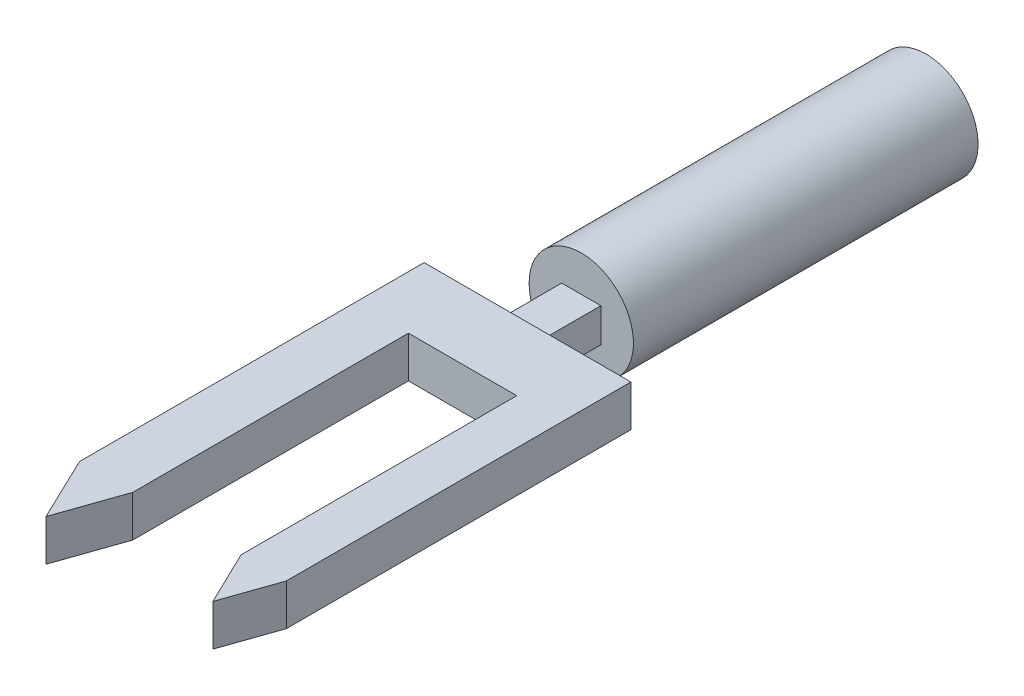
ISO-10303-21;
HEADER;
FILE_DESCRIPTION(('STEP AP214'),'2;1');
FILE_NAME('part.step','',(''),(''),'','','');
FILE_SCHEMA(('AUTOMOTIVE_DESIGN { 1 0 10303 214 1 1 1 1 }'));
ENDSEC;
DATA;
#1=APPLICATION_CONTEXT('core data for automotive mechanical design processes');
#2=APPLICATION_PROTOCOL_DEFINITION('international standard','automotive_design',2000,#1);
#3=PRODUCT_CONTEXT('',#1,'mechanical');
#4=PRODUCT('Part','Part','',(#3));
#5=PRODUCT_RELATED_PRODUCT_CATEGORY('part','',(#4));
#6=PRODUCT_DEFINITION_FORMATION('','',#4);
#7=PRODUCT_DEFINITION_CONTEXT('part definition',#1,'design');
#8=PRODUCT_DEFINITION('design','',#6,#7);
#9=PRODUCT_DEFINITION_SHAPE('','',#8);
#10=(LENGTH_UNIT() NAMED_UNIT(*) SI_UNIT(.MILLI.,.METRE.));
#11=(NAMED_UNIT(*) PLANE_ANGLE_UNIT() SI_UNIT($,.RADIAN.));
#12=(NAMED_UNIT(*) SI_UNIT($,.STERADIAN.) SOLID_ANGLE_UNIT());
#13=UNCERTAINTY_MEASURE_WITH_UNIT(LENGTH_MEASURE(1.E-05),#10,'distance_accuracy_value','');
#14=(GEOMETRIC_REPRESENTATION_CONTEXT(3) GLOBAL_UNCERTAINTY_ASSIGNED_CONTEXT((#13)) GLOBAL_UNIT_ASSIGNED_CONTEXT((#10,
#11,#12)) REPRESENTATION_CONTEXT('',''));
#15=CARTESIAN_POINT('',(0.,0.,0.));
#16=DIRECTION('',(0.,0.,1.));
#17=DIRECTION('',(1.,0.,0.));
#18=AXIS2_PLACEMENT_3D('',#15,#16,#17);
#19=CARTESIAN_POINT('',(-7.40174672489084,3.,0.));
#20=DIRECTION('',(0.,0.,1.));
#21=DIRECTION('',(1.,0.,0.));
#22=AXIS2_PLACEMENT_3D('',#19,#20,#21);
#23=PLANE('',#22);
#24=DIRECTION('',(-1.,0.,0.));
#25=VECTOR('',#24,1.);
#26=CARTESIAN_POINT('',(-7.40174672489084,0.,0.));
#27=LINE('',#26,#25);
#28=CARTESIAN_POINT('',(7.59825327510916,0.,0.));
#29=VERTEX_POINT('',#28);
#30=CARTESIAN_POINT('',(-7.40174672489084,0.,0.));
#31=VERTEX_POINT('',#30);
#32=EDGE_CURVE('E200',#29,#31,#27,.T.);
#33=ORIENTED_EDGE('',*,*,#32,.T.);
#34=DIRECTION('',(0.,-1.,0.));
#35=VECTOR('',#34,1.);
#36=CARTESIAN_POINT('',(-7.40174672489084,3.,0.));
#37=LINE('',#36,#35);
#38=CARTESIAN_POINT('',(-7.40174672489084,3.,0.));
#39=VERTEX_POINT('',#38);
#40=EDGE_CURVE('E227',#39,#31,#37,.T.);
#41=ORIENTED_EDGE('',*,*,#40,.F.);
#42=DIRECTION('',(-1.,0.,0.));
#43=VECTOR('',#42,1.);
#44=CARTESIAN_POINT('',(-7.40174672489084,3.,0.));
#45=LINE('',#44,#43);
#46=CARTESIAN_POINT('',(7.59825327510916,3.,0.));
#47=VERTEX_POINT('',#46);
#48=EDGE_CURVE('E224',#47,#39,#45,.T.);
#49=ORIENTED_EDGE('',*,*,#48,.F.);
#50=DIRECTION('',(0.,-1.,0.));
#51=VECTOR('',#50,1.);
#52=CARTESIAN_POINT('',(7.59825327510916,3.,0.));
#53=LINE('',#52,#51);
#54=EDGE_CURVE('E260',#47,#29,#53,.T.);
#55=ORIENTED_EDGE('',*,*,#54,.T.);
#56=EDGE_LOOP('',(#33,#41,#49,#55));
#57=FACE_BOUND('',#56,.T.);
#58=DIRECTION('',(0.,1.,0.));
#59=VECTOR('',#58,1.);
#60=CARTESIAN_POINT('',(-1.42119188494276,2.70424111089229,0.));
#61=LINE('',#60,#59);
#62=CARTESIAN_POINT('',(-1.42119188494276,0.247265958467898,0.));
#63=VERTEX_POINT('',#62);
#64=CARTESIAN_POINT('',(-1.42119188494276,2.70424111089229,0.));
#65=VERTEX_POINT('',#64);
#66=EDGE_CURVE('E59',#63,#65,#61,.T.);
#67=ORIENTED_EDGE('',*,*,#66,.F.);
#68=DIRECTION('',(-1.,0.,0.));
#69=VECTOR('',#68,1.);
#70=CARTESIAN_POINT('',(1.42119188494276,0.247265958467898,0.));
#71=LINE('',#70,#69);
#72=CARTESIAN_POINT('',(1.42119188494276,0.247265958467898,0.));
#73=VERTEX_POINT('',#72);
#74=EDGE_CURVE('E63',#73,#63,#71,.T.);
#75=ORIENTED_EDGE('',*,*,#74,.F.);
#76=DIRECTION('',(0.,-1.,0.));
#77=VECTOR('',#76,1.);
#78=CARTESIAN_POINT('',(1.42119188494276,2.70424111089229,0.));
#79=LINE('',#78,#77);
#80=CARTESIAN_POINT('',(1.42119188494276,2.70424111089229,0.));
#81=VERTEX_POINT('',#80);
#82=EDGE_CURVE('E181',#81,#73,#79,.T.);
#83=ORIENTED_EDGE('',*,*,#82,.F.);
#84=DIRECTION('',(1.,0.,0.));
#85=VECTOR('',#84,1.);
#86=CARTESIAN_POINT('',(1.42119188494276,2.70424111089229,0.));
#87=LINE('',#86,#85);
#88=EDGE_CURVE('E176',#65,#81,#87,.T.);
#89=ORIENTED_EDGE('',*,*,#88,.F.);
#90=EDGE_LOOP('',(#67,#75,#83,#89));
#91=FACE_BOUND('',#90,.T.);
#92=ADVANCED_FACE('F43',(#57,#91),#23,.F.);
#93=CARTESIAN_POINT('',(-7.40174672489084,3.,0.));
#94=DIRECTION('',(1.,0.,0.));
#95=DIRECTION('',(0.,0.,-1.));
#96=AXIS2_PLACEMENT_3D('',#93,#94,#95);
#97=PLANE('',#96);
#98=DIRECTION('',(0.,0.,1.));
#99=VECTOR('',#98,1.);
#100=CARTESIAN_POINT('',(-7.40174672489084,0.,0.));
#101=LINE('',#100,#99);
#102=CARTESIAN_POINT('',(-7.40174672489083,0.,25.));
#103=VERTEX_POINT('',#102);
#104=EDGE_CURVE('E194',#31,#103,#101,.T.);
#105=ORIENTED_EDGE('',*,*,#104,.T.);
#106=DIRECTION('',(0.,-1.,0.));
#107=VECTOR('',#106,1.);
#108=CARTESIAN_POINT('',(-7.40174672489083,3.,25.));
#109=LINE('',#108,#107);
#110=CARTESIAN_POINT('',(-7.40174672489083,3.,25.));
#111=VERTEX_POINT('',#110);
#112=EDGE_CURVE('E11',#111,#103,#109,.T.);
#113=ORIENTED_EDGE('',*,*,#112,.F.);
#114=DIRECTION('',(0.,0.,1.));
#115=VECTOR('',#114,1.);
#116=CARTESIAN_POINT('',(-7.40174672489084,3.,0.));
#117=LINE('',#116,#115);
#118=EDGE_CURVE('E195',#39,#111,#117,.T.);
#119=ORIENTED_EDGE('',*,*,#118,.F.);
#120=ORIENTED_EDGE('',*,*,#40,.T.);
#121=EDGE_LOOP('',(#105,#113,#119,#120));
#122=FACE_BOUND('',#121,.T.);
#123=ADVANCED_FACE('F45',(#122),#97,.F.);
#124=CARTESIAN_POINT('',(-7.40174672489083,3.,25.));
#125=DIRECTION('',(0.901656764531783,0.,-0.432452400818954));
#126=DIRECTION('',(-0.432452400818954,0.,-0.901656764531783));
#127=AXIS2_PLACEMENT_3D('',#124,#125,#126);
#128=PLANE('',#127);
#129=DIRECTION('',(0.432452400818954,0.,0.901656764531783));
#130=VECTOR('',#129,1.);
#131=CARTESIAN_POINT('',(-7.40174672489083,0.,25.));
#132=LINE('',#131,#130);
#133=CARTESIAN_POINT('',(-5.16387024743657,0.,29.6659388646288));
#134=VERTEX_POINT('',#133);
#135=EDGE_CURVE('E231',#103,#134,#132,.T.);
#136=ORIENTED_EDGE('',*,*,#135,.T.);
#137=DIRECTION('',(0.,-1.,0.));
#138=VECTOR('',#137,1.);
#139=CARTESIAN_POINT('',(-5.16387024743657,3.,29.6659388646288));
#140=LINE('',#139,#138);
#141=CARTESIAN_POINT('',(-5.16387024743657,3.,29.6659388646288));
#142=VERTEX_POINT('',#141);
#143=EDGE_CURVE('E52',#142,#134,#140,.T.);
#144=ORIENTED_EDGE('',*,*,#143,.F.);
#145=DIRECTION('',(0.432452400818954,0.,0.901656764531783));
#146=VECTOR('',#145,1.);
#147=CARTESIAN_POINT('',(-7.40174672489083,3.,25.));
#148=LINE('',#147,#146);
#149=EDGE_CURVE('E199',#111,#142,#148,.T.);
#150=ORIENTED_EDGE('',*,*,#149,.F.);
#151=ORIENTED_EDGE('',*,*,#112,.T.);
#152=EDGE_LOOP('',(#136,#144,#150,#151));
#153=FACE_BOUND('',#152,.T.);
#154=ADVANCED_FACE('F316',(#153),#128,.F.);
#155=CARTESIAN_POINT('',(-3.53711790393013,3.,25.));
#156=DIRECTION('',(-0.944256857369617,0.,-0.329209640366826));
#157=DIRECTION('',(-0.329209640366826,0.,0.944256857369617));
#158=AXIS2_PLACEMENT_3D('',#155,#156,#157);
#159=PLANE('',#158);
#160=DIRECTION('',(0.329209640366826,0.,-0.944256857369617));
#161=VECTOR('',#160,1.);
#162=CARTESIAN_POINT('',(-3.53711790393013,0.,25.));
#163=LINE('',#162,#161);
#164=CARTESIAN_POINT('',(-3.53711790393013,0.,25.));
#165=VERTEX_POINT('',#164);
#166=EDGE_CURVE('E234',#134,#165,#163,.T.);
#167=ORIENTED_EDGE('',*,*,#166,.T.);
#168=DIRECTION('',(0.,-1.,0.));
#169=VECTOR('',#168,1.);
#170=CARTESIAN_POINT('',(-3.53711790393013,3.,25.));
#171=LINE('',#170,#169);
#172=CARTESIAN_POINT('',(-3.53711790393013,3.,25.));
#173=VERTEX_POINT('',#172);
#174=EDGE_CURVE('E284',#173,#165,#171,.T.);
#175=ORIENTED_EDGE('',*,*,#174,.F.);
#176=DIRECTION('',(0.329209640366826,0.,-0.944256857369617));
#177=VECTOR('',#176,1.);
#178=CARTESIAN_POINT('',(-3.53711790393013,3.,25.));
#179=LINE('',#178,#177);
#180=EDGE_CURVE('E203',#142,#173,#179,.T.);
#181=ORIENTED_EDGE('',*,*,#180,.F.);
#182=ORIENTED_EDGE('',*,*,#143,.T.);
#183=EDGE_LOOP('',(#167,#175,#181,#182));
#184=FACE_BOUND('',#183,.T.);
#185=ADVANCED_FACE('F293',(#184),#159,.F.);
#186=CARTESIAN_POINT('',(-3.53711790393013,3.,5.));
#187=DIRECTION('',(-1.,0.,0.));
#188=DIRECTION('',(0.,0.,1.));
#189=AXIS2_PLACEMENT_3D('',#186,#187,#188);
#190=PLANE('',#189);
#191=DIRECTION('',(0.,0.,-1.));
#192=VECTOR('',#191,1.);
#193=CARTESIAN_POINT('',(-3.53711790393013,0.,5.));
#194=LINE('',#193,#192);
#195=CARTESIAN_POINT('',(-3.53711790393013,0.,5.));
#196=VERTEX_POINT('',#195);
#197=EDGE_CURVE('E237',#165,#196,#194,.T.);
#198=ORIENTED_EDGE('',*,*,#197,.T.);
#199=DIRECTION('',(0.,-1.,0.));
#200=VECTOR('',#199,1.);
#201=CARTESIAN_POINT('',(-3.53711790393013,3.,5.));
#202=LINE('',#201,#200);
#203=CARTESIAN_POINT('',(-3.53711790393013,3.,5.));
#204=VERTEX_POINT('',#203);
#205=EDGE_CURVE('E280',#204,#196,#202,.T.);
#206=ORIENTED_EDGE('',*,*,#205,.F.);
#207=DIRECTION('',(0.,0.,-1.));
#208=VECTOR('',#207,1.);
#209=CARTESIAN_POINT('',(-3.53711790393013,3.,5.));
#210=LINE('',#209,#208);
#211=EDGE_CURVE('E206',#173,#204,#210,.T.);
#212=ORIENTED_EDGE('',*,*,#211,.F.);
#213=ORIENTED_EDGE('',*,*,#174,.T.);
#214=EDGE_LOOP('',(#198,#206,#212,#213));
#215=FACE_BOUND('',#214,.T.);
#216=ADVANCED_FACE('F304',(#215),#190,.F.);
#217=CARTESIAN_POINT('',(4.31718699883337,3.,5.));
#218=DIRECTION('',(0.,0.,-1.));
#219=DIRECTION('',(-1.,0.,0.));
#220=AXIS2_PLACEMENT_3D('',#217,#218,#219);
#221=PLANE('',#220);
#222=DIRECTION('',(1.,0.,0.));
#223=VECTOR('',#222,1.);
#224=CARTESIAN_POINT('',(4.31718699883337,0.,5.));
#225=LINE('',#224,#223);
#226=CARTESIAN_POINT('',(4.31718699883337,0.,5.));
#227=VERTEX_POINT('',#226);
#228=EDGE_CURVE('E240',#196,#227,#225,.T.);
#229=ORIENTED_EDGE('',*,*,#228,.T.);
#230=DIRECTION('',(0.,-1.,0.));
#231=VECTOR('',#230,1.);
#232=CARTESIAN_POINT('',(4.31718699883337,3.,5.));
#233=LINE('',#232,#231);
#234=CARTESIAN_POINT('',(4.31718699883337,3.,5.));
#235=VERTEX_POINT('',#234);
#236=EDGE_CURVE('E276',#235,#227,#233,.T.);
#237=ORIENTED_EDGE('',*,*,#236,.F.);
#238=DIRECTION('',(1.,0.,0.));
#239=VECTOR('',#238,1.);
#240=CARTESIAN_POINT('',(4.31718699883337,3.,5.));
#241=LINE('',#240,#239);
#242=EDGE_CURVE('E209',#204,#235,#241,.T.);
#243=ORIENTED_EDGE('',*,*,#242,.F.);
#244=ORIENTED_EDGE('',*,*,#205,.T.);
#245=EDGE_LOOP('',(#229,#237,#243,#244));
#246=FACE_BOUND('',#245,.T.);
#247=ADVANCED_FACE('F308',(#246),#221,.F.);
#248=CARTESIAN_POINT('',(4.31718699883337,3.,25.));
#249=DIRECTION('',(1.,0.,0.));
#250=DIRECTION('',(0.,0.,-1.));
#251=AXIS2_PLACEMENT_3D('',#248,#249,#250);
#252=PLANE('',#251);
#253=DIRECTION('',(0.,0.,1.));
#254=VECTOR('',#253,1.);
#255=CARTESIAN_POINT('',(4.31718699883337,0.,25.));
#256=LINE('',#255,#254);
#257=CARTESIAN_POINT('',(4.31718699883337,0.,25.));
#258=VERTEX_POINT('',#257);
#259=EDGE_CURVE('E243',#227,#258,#256,.T.);
#260=ORIENTED_EDGE('',*,*,#259,.T.);
#261=DIRECTION('',(0.,-1.,0.));
#262=VECTOR('',#261,1.);
#263=CARTESIAN_POINT('',(4.31718699883337,3.,25.));
#264=LINE('',#263,#262);
#265=CARTESIAN_POINT('',(4.31718699883337,3.,25.));
#266=VERTEX_POINT('',#265);
#267=EDGE_CURVE('E272',#266,#258,#264,.T.);
#268=ORIENTED_EDGE('',*,*,#267,.F.);
#269=DIRECTION('',(0.,0.,1.));
#270=VECTOR('',#269,1.);
#271=CARTESIAN_POINT('',(4.31718699883337,3.,25.));
#272=LINE('',#271,#270);
#273=EDGE_CURVE('E212',#235,#266,#272,.T.);
#274=ORIENTED_EDGE('',*,*,#273,.F.);
#275=ORIENTED_EDGE('',*,*,#236,.T.);
#276=EDGE_LOOP('',(#260,#268,#274,#275));
#277=FACE_BOUND('',#276,.T.);
#278=ADVANCED_FACE('F338',(#277),#252,.F.);
#279=CARTESIAN_POINT('',(6.22270742358079,3.,28.9454148471616));
#280=DIRECTION('',(0.900476796163312,0.,-0.434904057892608));
#281=DIRECTION('',(-0.434904057892608,0.,-0.900476796163312));
#282=AXIS2_PLACEMENT_3D('',#279,#280,#281);
#283=PLANE('',#282);
#284=DIRECTION('',(0.434904057892608,0.,0.900476796163312));
#285=VECTOR('',#284,1.);
#286=CARTESIAN_POINT('',(6.22270742358079,0.,28.9454148471616));
#287=LINE('',#286,#285);
#288=CARTESIAN_POINT('',(6.22270742358079,0.,28.9454148471616));
#289=VERTEX_POINT('',#288);
#290=EDGE_CURVE('E246',#258,#289,#287,.T.);
#291=ORIENTED_EDGE('',*,*,#290,.T.);
#292=DIRECTION('',(0.,-1.,0.));
#293=VECTOR('',#292,1.);
#294=CARTESIAN_POINT('',(6.22270742358079,3.,28.9454148471616));
#295=LINE('',#294,#293);
#296=CARTESIAN_POINT('',(6.22270742358079,3.,28.9454148471616));
#297=VERTEX_POINT('',#296);
#298=EDGE_CURVE('E268',#297,#289,#295,.T.);
#299=ORIENTED_EDGE('',*,*,#298,.F.);
#300=DIRECTION('',(0.434904057892608,0.,0.900476796163312));
#301=VECTOR('',#300,1.);
#302=CARTESIAN_POINT('',(6.22270742358079,3.,28.9454148471616));
#303=LINE('',#302,#301);
#304=EDGE_CURVE('E215',#266,#297,#303,.T.);
#305=ORIENTED_EDGE('',*,*,#304,.F.);
#306=ORIENTED_EDGE('',*,*,#267,.T.);
#307=EDGE_LOOP('',(#291,#299,#305,#306));
#308=FACE_BOUND('',#307,.T.);
#309=ADVANCED_FACE('F335',(#308),#283,.F.);
#310=CARTESIAN_POINT('',(7.59825327510916,3.,25.));
#311=DIRECTION('',(-0.944256857369617,0.,-0.329209640366826));
#312=DIRECTION('',(-0.329209640366826,0.,0.944256857369617));
#313=AXIS2_PLACEMENT_3D('',#310,#311,#312);
#314=PLANE('',#313);
#315=DIRECTION('',(0.329209640366826,0.,-0.944256857369617));
#316=VECTOR('',#315,1.);
#317=CARTESIAN_POINT('',(7.59825327510916,0.,25.));
#318=LINE('',#317,#316);
#319=CARTESIAN_POINT('',(7.59825327510916,0.,25.));
#320=VERTEX_POINT('',#319);
#321=EDGE_CURVE('E249',#289,#320,#318,.T.);
#322=ORIENTED_EDGE('',*,*,#321,.T.);
#323=DIRECTION('',(0.,-1.,0.));
#324=VECTOR('',#323,1.);
#325=CARTESIAN_POINT('',(7.59825327510916,3.,25.));
#326=LINE('',#325,#324);
#327=CARTESIAN_POINT('',(7.59825327510916,3.,25.));
#328=VERTEX_POINT('',#327);
#329=EDGE_CURVE('E264',#328,#320,#326,.T.);
#330=ORIENTED_EDGE('',*,*,#329,.F.);
#331=DIRECTION('',(0.329209640366826,0.,-0.944256857369617));
#332=VECTOR('',#331,1.);
#333=CARTESIAN_POINT('',(7.59825327510916,3.,25.));
#334=LINE('',#333,#332);
#335=EDGE_CURVE('E218',#297,#328,#334,.T.);
#336=ORIENTED_EDGE('',*,*,#335,.F.);
#337=ORIENTED_EDGE('',*,*,#298,.T.);
#338=EDGE_LOOP('',(#322,#330,#336,#337));
#339=FACE_BOUND('',#338,.T.);
#340=ADVANCED_FACE('F331',(#339),#314,.F.);
#341=CARTESIAN_POINT('',(7.59825327510916,3.,0.));
#342=DIRECTION('',(-1.,0.,0.));
#343=DIRECTION('',(0.,0.,1.));
#344=AXIS2_PLACEMENT_3D('',#341,#342,#343);
#345=PLANE('',#344);
#346=DIRECTION('',(0.,0.,-1.));
#347=VECTOR('',#346,1.);
#348=CARTESIAN_POINT('',(7.59825327510916,0.,0.));
#349=LINE('',#348,#347);
#350=EDGE_CURVE('E252',#320,#29,#349,.T.);
#351=ORIENTED_EDGE('',*,*,#350,.T.);
#352=ORIENTED_EDGE('',*,*,#54,.F.);
#353=DIRECTION('',(0.,0.,-1.));
#354=VECTOR('',#353,1.);
#355=CARTESIAN_POINT('',(7.59825327510916,3.,0.));
#356=LINE('',#355,#354);
#357=EDGE_CURVE('E221',#328,#47,#356,.T.);
#358=ORIENTED_EDGE('',*,*,#357,.F.);
#359=ORIENTED_EDGE('',*,*,#329,.T.);
#360=EDGE_LOOP('',(#351,#352,#358,#359));
#361=FACE_BOUND('',#360,.T.);
#362=ADVANCED_FACE('F327',(#361),#345,.F.);
#363=CARTESIAN_POINT('',(0.,3.,0.));
#364=DIRECTION('',(0.,-1.,0.));
#365=DIRECTION('',(0.,0.,-1.));
#366=AXIS2_PLACEMENT_3D('',#363,#364,#365);
#367=PLANE('',#366);
#368=ORIENTED_EDGE('',*,*,#118,.T.);
#369=ORIENTED_EDGE('',*,*,#149,.T.);
#370=ORIENTED_EDGE('',*,*,#180,.T.);
#371=ORIENTED_EDGE('',*,*,#211,.T.);
#372=ORIENTED_EDGE('',*,*,#242,.T.);
#373=ORIENTED_EDGE('',*,*,#273,.T.);
#374=ORIENTED_EDGE('',*,*,#304,.T.);
#375=ORIENTED_EDGE('',*,*,#335,.T.);
#376=ORIENTED_EDGE('',*,*,#357,.T.);
#377=ORIENTED_EDGE('',*,*,#48,.T.);
#378=EDGE_LOOP('',(#368,#369,#370,#371,#372,#373,#374,#375,#376,#377));
#379=FACE_BOUND('',#378,.T.);
#380=ADVANCED_FACE('F312',(#379),#367,.F.);
#381=CARTESIAN_POINT('',(0.,0.,0.));
#382=DIRECTION('',(0.,-1.,0.));
#383=DIRECTION('',(0.,0.,-1.));
#384=AXIS2_PLACEMENT_3D('',#381,#382,#383);
#385=PLANE('',#384);
#386=ORIENTED_EDGE('',*,*,#104,.F.);
#387=ORIENTED_EDGE('',*,*,#32,.F.);
#388=ORIENTED_EDGE('',*,*,#350,.F.);
#389=ORIENTED_EDGE('',*,*,#321,.F.);
#390=ORIENTED_EDGE('',*,*,#290,.F.);
#391=ORIENTED_EDGE('',*,*,#259,.F.);
#392=ORIENTED_EDGE('',*,*,#228,.F.);
#393=ORIENTED_EDGE('',*,*,#197,.F.);
#394=ORIENTED_EDGE('',*,*,#166,.F.);
#395=ORIENTED_EDGE('',*,*,#135,.F.);
#396=EDGE_LOOP('',(#386,#387,#388,#389,#390,#391,#392,#393,#394,#395));
#397=FACE_BOUND('',#396,.T.);
#398=ADVANCED_FACE('F299',(#397),#385,.T.);
#399=CARTESIAN_POINT('',(-1.42119188494276,2.70424111089229,-4.));
#400=DIRECTION('',(1.,0.,0.));
#401=DIRECTION('',(0.,0.,-1.));
#402=AXIS2_PLACEMENT_3D('',#399,#400,#401);
#403=PLANE('',#402);
#404=ORIENTED_EDGE('',*,*,#66,.T.);
#405=DIRECTION('',(0.,0.,1.));
#406=VECTOR('',#405,1.);
#407=CARTESIAN_POINT('',(-1.42119188494276,2.70424111089229,-4.));
#408=LINE('',#407,#406);
#409=CARTESIAN_POINT('',(-1.42119188494276,2.70424111089229,-4.));
#410=VERTEX_POINT('',#409);
#411=EDGE_CURVE('E149',#410,#65,#408,.T.);
#412=ORIENTED_EDGE('',*,*,#411,.F.);
#413=DIRECTION('',(0.,1.,0.));
#414=VECTOR('',#413,1.);
#415=CARTESIAN_POINT('',(-1.42119188494276,2.70424111089229,-4.));
#416=LINE('',#415,#414);
#417=CARTESIAN_POINT('',(-1.42119188494276,0.247265958467898,-4.));
#418=VERTEX_POINT('',#417);
#419=EDGE_CURVE('E144',#418,#410,#416,.T.);
#420=ORIENTED_EDGE('',*,*,#419,.F.);
#421=DIRECTION('',(0.,0.,1.));
#422=VECTOR('',#421,1.);
#423=CARTESIAN_POINT('',(-1.42119188494276,0.247265958467898,-4.));
#424=LINE('',#423,#422);
#425=EDGE_CURVE('E147',#418,#63,#424,.T.);
#426=ORIENTED_EDGE('',*,*,#425,.T.);
#427=EDGE_LOOP('',(#404,#412,#420,#426));
#428=FACE_BOUND('',#427,.T.);
#429=ADVANCED_FACE('F146',(#428),#403,.F.);
#430=CARTESIAN_POINT('',(1.42119188494276,2.70424111089229,-4.));
#431=DIRECTION('',(0.,-1.,0.));
#432=DIRECTION('',(0.,0.,-1.));
#433=AXIS2_PLACEMENT_3D('',#430,#431,#432);
#434=PLANE('',#433);
#435=ORIENTED_EDGE('',*,*,#88,.T.);
#436=DIRECTION('',(0.,0.,1.));
#437=VECTOR('',#436,1.);
#438=CARTESIAN_POINT('',(1.42119188494276,2.70424111089229,-4.));
#439=LINE('',#438,#437);
#440=CARTESIAN_POINT('',(1.42119188494276,2.70424111089229,-4.));
#441=VERTEX_POINT('',#440);
#442=EDGE_CURVE('E188',#441,#81,#439,.T.);
#443=ORIENTED_EDGE('',*,*,#442,.F.);
#444=DIRECTION('',(1.,0.,0.));
#445=VECTOR('',#444,1.);
#446=CARTESIAN_POINT('',(1.42119188494276,2.70424111089229,-4.));
#447=LINE('',#446,#445);
#448=EDGE_CURVE('E154',#410,#441,#447,.T.);
#449=ORIENTED_EDGE('',*,*,#448,.F.);
#450=ORIENTED_EDGE('',*,*,#411,.T.);
#451=EDGE_LOOP('',(#435,#443,#449,#450));
#452=FACE_BOUND('',#451,.T.);
#453=ADVANCED_FACE('F382',(#452),#434,.F.);
#454=CARTESIAN_POINT('',(1.42119188494276,2.70424111089229,-4.));
#455=DIRECTION('',(-1.,0.,0.));
#456=DIRECTION('',(0.,0.,1.));
#457=AXIS2_PLACEMENT_3D('',#454,#455,#456);
#458=PLANE('',#457);
#459=ORIENTED_EDGE('',*,*,#82,.T.);
#460=DIRECTION('',(0.,0.,1.));
#461=VECTOR('',#460,1.);
#462=CARTESIAN_POINT('',(1.42119188494276,0.247265958467898,-4.));
#463=LINE('',#462,#461);
#464=CARTESIAN_POINT('',(1.42119188494276,0.247265958467898,-4.));
#465=VERTEX_POINT('',#464);
#466=EDGE_CURVE('E163',#465,#73,#463,.T.);
#467=ORIENTED_EDGE('',*,*,#466,.F.);
#468=DIRECTION('',(0.,-1.,0.));
#469=VECTOR('',#468,1.);
#470=CARTESIAN_POINT('',(1.42119188494276,2.70424111089229,-4.));
#471=LINE('',#470,#469);
#472=EDGE_CURVE('E167',#441,#465,#471,.T.);
#473=ORIENTED_EDGE('',*,*,#472,.F.);
#474=ORIENTED_EDGE('',*,*,#442,.T.);
#475=EDGE_LOOP('',(#459,#467,#473,#474));
#476=FACE_BOUND('',#475,.T.);
#477=ADVANCED_FACE('F389',(#476),#458,.F.);
#478=CARTESIAN_POINT('',(1.42119188494276,0.247265958467898,-4.));
#479=DIRECTION('',(0.,1.,0.));
#480=DIRECTION('',(0.,0.,1.));
#481=AXIS2_PLACEMENT_3D('',#478,#479,#480);
#482=PLANE('',#481);
#483=ORIENTED_EDGE('',*,*,#74,.T.);
#484=ORIENTED_EDGE('',*,*,#425,.F.);
#485=DIRECTION('',(-1.,0.,0.));
#486=VECTOR('',#485,1.);
#487=CARTESIAN_POINT('',(1.42119188494276,0.247265958467898,-4.));
#488=LINE('',#487,#486);
#489=EDGE_CURVE('E160',#465,#418,#488,.T.);
#490=ORIENTED_EDGE('',*,*,#489,.F.);
#491=ORIENTED_EDGE('',*,*,#466,.T.);
#492=EDGE_LOOP('',(#483,#484,#490,#491));
#493=FACE_BOUND('',#492,.T.);
#494=ADVANCED_FACE('F158',(#493),#482,.F.);
#495=CARTESIAN_POINT('',(0.,1.52424646532009,-4.));
#496=DIRECTION('',(0.,0.,-1.));
#497=DIRECTION('',(-1.,0.,0.));
#498=AXIS2_PLACEMENT_3D('',#495,#496,#497);
#499=PLANE('',#498);
#500=CARTESIAN_POINT('',(0.,1.52424646532009,-4.));
#501=DIRECTION('',(0.,0.,-1.));
#502=DIRECTION('',(-1.,0.,0.));
#503=AXIS2_PLACEMENT_3D('',#500,#501,#502);
#504=CIRCLE('',#503,3.78528090306434);
#505=CARTESIAN_POINT('',(-3.78528090306434,1.52424646532009,-4.));
#506=VERTEX_POINT('',#505);
#507=EDGE_CURVE('E539',#506,#506,#504,.T.);
#508=ORIENTED_EDGE('',*,*,#507,.F.);
#509=EDGE_LOOP('',(#508));
#510=FACE_BOUND('',#509,.T.);
#511=ORIENTED_EDGE('',*,*,#489,.T.);
#512=ORIENTED_EDGE('',*,*,#419,.T.);
#513=ORIENTED_EDGE('',*,*,#448,.T.);
#514=ORIENTED_EDGE('',*,*,#472,.T.);
#515=EDGE_LOOP('',(#511,#512,#513,#514));
#516=FACE_BOUND('',#515,.T.);
#517=ADVANCED_FACE('F165',(#510,#516),#499,.F.);
#518=CARTESIAN_POINT('',(0.,1.52424646532009,-29.));
#519=DIRECTION('',(0.,0.,1.));
#520=DIRECTION('',(1.,0.,0.));
#521=AXIS2_PLACEMENT_3D('',#518,#519,#520);
#522=CYLINDRICAL_SURFACE('',#521,3.78528090306434);
#523=CARTESIAN_POINT('',(0.,1.52424646532009,-29.));
#524=DIRECTION('',(0.,0.,-1.));
#525=DIRECTION('',(-1.,0.,0.));
#526=AXIS2_PLACEMENT_3D('',#523,#524,#525);
#527=CIRCLE('',#526,3.78528090306434);
#528=CARTESIAN_POINT('',(-3.78528090306434,1.52424646532009,-29.));
#529=VERTEX_POINT('',#528);
#530=EDGE_CURVE('E177',#529,#529,#527,.T.);
#531=ORIENTED_EDGE('',*,*,#530,.F.);
#532=EDGE_LOOP('',(#531));
#533=FACE_BOUND('',#532,.T.);
#534=ORIENTED_EDGE('',*,*,#507,.T.);
#535=EDGE_LOOP('',(#534));
#536=FACE_BOUND('',#535,.T.);
#537=ADVANCED_FACE('F410',(#533,#536),#522,.T.);
#538=CARTESIAN_POINT('',(0.,1.52424646532009,-29.));
#539=DIRECTION('',(0.,0.,-1.));
#540=DIRECTION('',(-1.,0.,0.));
#541=AXIS2_PLACEMENT_3D('',#538,#539,#540);
#542=PLANE('',#541);
#543=ORIENTED_EDGE('',*,*,#530,.T.);
#544=EDGE_LOOP('',(#543));
#545=FACE_BOUND('',#544,.T.);
#546=ADVANCED_FACE('F418',(#545),#542,.T.);
#547=CLOSED_SHELL('',(#92,#123,#154,#185,#216,#247,#278,#309,#340,#362,#380,#398,#429,#453,#477,
#494,#517,#537,#546));
#548=MANIFOLD_SOLID_BREP('B2',#547);
#549=ADVANCED_BREP_SHAPE_REPRESENTATION('',(#18,#548),#14);
#550=SHAPE_DEFINITION_REPRESENTATION(#9,#549);
ENDSEC;
END-ISO-10303-21;
